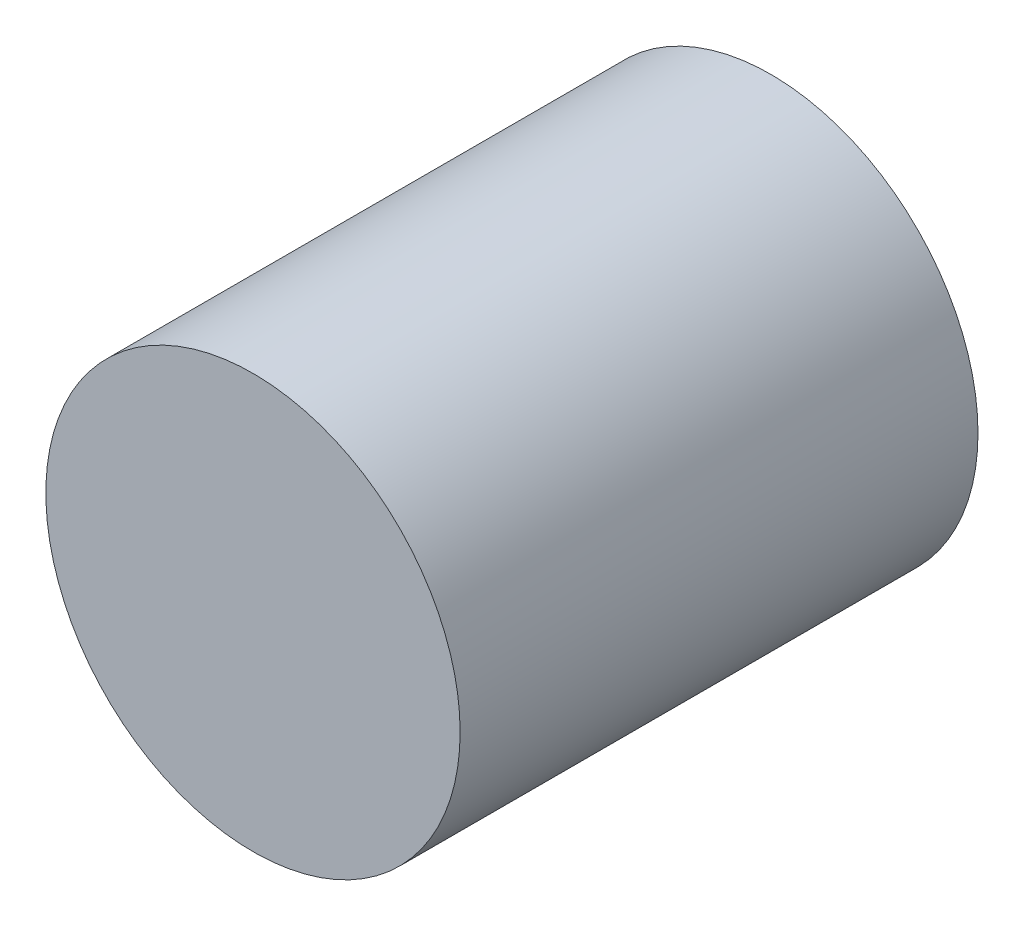
ISO-10303-21;
HEADER;
FILE_DESCRIPTION(('STEP AP214'),'2;1');
FILE_NAME('part.step','',(''),(''),'','','');
FILE_SCHEMA(('AUTOMOTIVE_DESIGN { 1 0 10303 214 1 1 1 1 }'));
ENDSEC;
DATA;
#1=APPLICATION_CONTEXT('core data for automotive mechanical design processes');
#2=APPLICATION_PROTOCOL_DEFINITION('international standard','automotive_design',2000,#1);
#3=PRODUCT_CONTEXT('',#1,'mechanical');
#4=PRODUCT('Part','Part','',(#3));
#5=PRODUCT_RELATED_PRODUCT_CATEGORY('part','',(#4));
#6=PRODUCT_DEFINITION_FORMATION('','',#4);
#7=PRODUCT_DEFINITION_CONTEXT('part definition',#1,'design');
#8=PRODUCT_DEFINITION('design','',#6,#7);
#9=PRODUCT_DEFINITION_SHAPE('','',#8);
#10=(LENGTH_UNIT() NAMED_UNIT(*) SI_UNIT(.MILLI.,.METRE.));
#11=(NAMED_UNIT(*) PLANE_ANGLE_UNIT() SI_UNIT($,.RADIAN.));
#12=(NAMED_UNIT(*) SI_UNIT($,.STERADIAN.) SOLID_ANGLE_UNIT());
#13=UNCERTAINTY_MEASURE_WITH_UNIT(LENGTH_MEASURE(1.E-05),#10,'distance_accuracy_value','');
#14=(GEOMETRIC_REPRESENTATION_CONTEXT(3) GLOBAL_UNCERTAINTY_ASSIGNED_CONTEXT((#13)) GLOBAL_UNIT_ASSIGNED_CONTEXT((#10,
#11,#12)) REPRESENTATION_CONTEXT('',''));
#15=CARTESIAN_POINT('',(0.,0.,0.));
#16=DIRECTION('',(0.,0.,1.));
#17=DIRECTION('',(1.,0.,0.));
#18=AXIS2_PLACEMENT_3D('',#15,#16,#17);
#19=CARTESIAN_POINT('',(0.,0.,500.));
#20=DIRECTION('',(0.,0.,-1.));
#21=DIRECTION('',(-1.,0.,0.));
#22=AXIS2_PLACEMENT_3D('',#19,#20,#21);
#23=CYLINDRICAL_SURFACE('',#22,200.);
#24=CARTESIAN_POINT('',(0.,0.,500.));
#25=DIRECTION('',(0.,0.,1.));
#26=DIRECTION('',(1.,0.,0.));
#27=AXIS2_PLACEMENT_3D('',#24,#25,#26);
#28=CIRCLE('',#27,200.);
#29=CARTESIAN_POINT('',(200.,0.,500.));
#30=VERTEX_POINT('',#29);
#31=EDGE_CURVE('E10',#30,#30,#28,.T.);
#32=ORIENTED_EDGE('',*,*,#31,.F.);
#33=EDGE_LOOP('',(#32));
#34=FACE_BOUND('',#33,.T.);
#35=CARTESIAN_POINT('',(0.,0.,0.));
#36=DIRECTION('',(0.,0.,1.));
#37=DIRECTION('',(1.,0.,0.));
#38=AXIS2_PLACEMENT_3D('',#35,#36,#37);
#39=CIRCLE('',#38,200.);
#40=CARTESIAN_POINT('',(200.,0.,0.));
#41=VERTEX_POINT('',#40);
#42=EDGE_CURVE('E44',#41,#41,#39,.T.);
#43=ORIENTED_EDGE('',*,*,#42,.T.);
#44=EDGE_LOOP('',(#43));
#45=FACE_BOUND('',#44,.T.);
#46=ADVANCED_FACE('F41',(#34,#45),#23,.T.);
#47=CARTESIAN_POINT('',(0.,0.,500.));
#48=DIRECTION('',(0.,0.,1.));
#49=DIRECTION('',(1.,0.,0.));
#50=AXIS2_PLACEMENT_3D('',#47,#48,#49);
#51=PLANE('',#50);
#52=ORIENTED_EDGE('',*,*,#31,.T.);
#53=EDGE_LOOP('',(#52));
#54=FACE_BOUND('',#53,.T.);
#55=ADVANCED_FACE('F58',(#54),#51,.T.);
#56=CARTESIAN_POINT('',(0.,0.,0.));
#57=DIRECTION('',(0.,0.,1.));
#58=DIRECTION('',(1.,0.,0.));
#59=AXIS2_PLACEMENT_3D('',#56,#57,#58);
#60=PLANE('',#59);
#61=ORIENTED_EDGE('',*,*,#42,.F.);
#62=EDGE_LOOP('',(#61));
#63=FACE_BOUND('',#62,.T.);
#64=ADVANCED_FACE('F56',(#63),#60,.F.);
#65=CLOSED_SHELL('',(#46,#55,#64));
#66=MANIFOLD_SOLID_BREP('B2',#65);
#67=ADVANCED_BREP_SHAPE_REPRESENTATION('',(#18,#66),#14);
#68=SHAPE_DEFINITION_REPRESENTATION(#9,#67);
ENDSEC;
END-ISO-10303-21;
